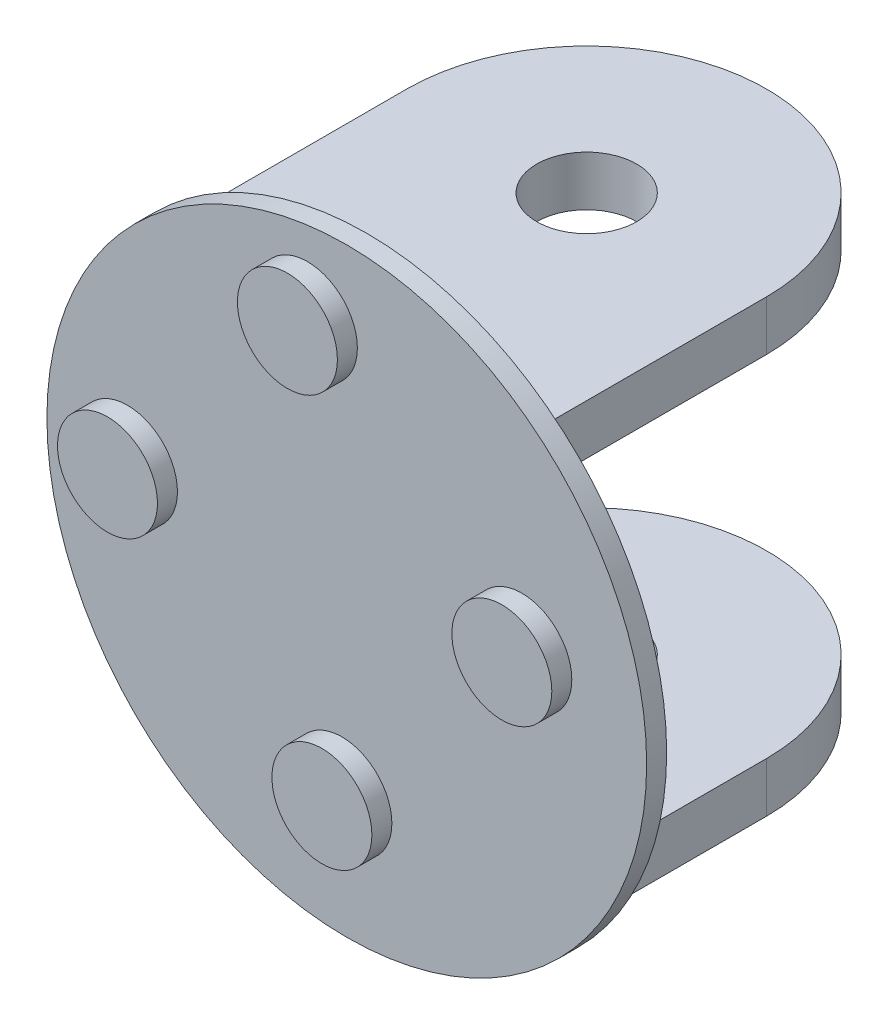
ISO-10303-21;
HEADER;
FILE_DESCRIPTION(('STEP AP214'),'2;1');
FILE_NAME('part.step','',(''),(''),'','','');
FILE_SCHEMA(('AUTOMOTIVE_DESIGN { 1 0 10303 214 1 1 1 1 }'));
ENDSEC;
DATA;
#1=APPLICATION_CONTEXT('core data for automotive mechanical design processes');
#2=APPLICATION_PROTOCOL_DEFINITION('international standard','automotive_design',2000,#1);
#3=PRODUCT_CONTEXT('',#1,'mechanical');
#4=PRODUCT('Part','Part','',(#3));
#5=PRODUCT_RELATED_PRODUCT_CATEGORY('part','',(#4));
#6=PRODUCT_DEFINITION_FORMATION('','',#4);
#7=PRODUCT_DEFINITION_CONTEXT('part definition',#1,'design');
#8=PRODUCT_DEFINITION('design','',#6,#7);
#9=PRODUCT_DEFINITION_SHAPE('','',#8);
#10=(LENGTH_UNIT() NAMED_UNIT(*) SI_UNIT(.MILLI.,.METRE.));
#11=(NAMED_UNIT(*) PLANE_ANGLE_UNIT() SI_UNIT($,.RADIAN.));
#12=(NAMED_UNIT(*) SI_UNIT($,.STERADIAN.) SOLID_ANGLE_UNIT());
#13=UNCERTAINTY_MEASURE_WITH_UNIT(LENGTH_MEASURE(1.E-05),#10,'distance_accuracy_value','');
#14=(GEOMETRIC_REPRESENTATION_CONTEXT(3) GLOBAL_UNCERTAINTY_ASSIGNED_CONTEXT((#13)) GLOBAL_UNIT_ASSIGNED_CONTEXT((#10,
#11,#12)) REPRESENTATION_CONTEXT('',''));
#15=CARTESIAN_POINT('',(0.,0.,0.));
#16=DIRECTION('',(0.,0.,1.));
#17=DIRECTION('',(1.,0.,0.));
#18=AXIS2_PLACEMENT_3D('',#15,#16,#17);
#19=CARTESIAN_POINT('',(0.,0.,-2.));
#20=DIRECTION('',(0.,0.,1.));
#21=DIRECTION('',(1.,0.,0.));
#22=AXIS2_PLACEMENT_3D('',#19,#20,#21);
#23=PLANE('',#22);
#24=DIRECTION('',(1.,0.,0.));
#25=VECTOR('',#24,1.);
#26=CARTESIAN_POINT('',(-18.,17.5,-2.));
#27=LINE('',#26,#25);
#28=CARTESIAN_POINT('',(-18.,17.5,-2.));
#29=VERTEX_POINT('',#28);
#30=CARTESIAN_POINT('',(18.,17.5,-2.));
#31=VERTEX_POINT('',#30);
#32=EDGE_CURVE('E426',#29,#31,#27,.T.);
#33=ORIENTED_EDGE('',*,*,#32,.T.);
#34=DIRECTION('',(0.,1.,0.));
#35=VECTOR('',#34,1.);
#36=CARTESIAN_POINT('',(18.,17.5,-2.));
#37=LINE('',#36,#35);
#38=CARTESIAN_POINT('',(18.,22.5,-2.));
#39=VERTEX_POINT('',#38);
#40=EDGE_CURVE('E420',#31,#39,#37,.T.);
#41=ORIENTED_EDGE('',*,*,#40,.T.);
#42=DIRECTION('',(-1.,0.,0.));
#43=VECTOR('',#42,1.);
#44=CARTESIAN_POINT('',(-18.,22.5,-2.));
#45=LINE('',#44,#43);
#46=CARTESIAN_POINT('',(-18.,22.5,-2.));
#47=VERTEX_POINT('',#46);
#48=EDGE_CURVE('E422',#39,#47,#45,.T.);
#49=ORIENTED_EDGE('',*,*,#48,.T.);
#50=DIRECTION('',(0.,-1.,0.));
#51=VECTOR('',#50,1.);
#52=CARTESIAN_POINT('',(-18.,17.5,-2.));
#53=LINE('',#52,#51);
#54=EDGE_CURVE('E50',#47,#29,#53,.T.);
#55=ORIENTED_EDGE('',*,*,#54,.T.);
#56=EDGE_LOOP('',(#33,#41,#49,#55));
#57=FACE_BOUND('',#56,.T.);
#58=CARTESIAN_POINT('',(0.,0.,-2.));
#59=DIRECTION('',(0.,0.,1.));
#60=DIRECTION('',(1.,0.,0.));
#61=AXIS2_PLACEMENT_3D('',#58,#59,#60);
#62=CIRCLE('',#61,30.);
#63=CARTESIAN_POINT('',(30.,0.,-2.));
#64=VERTEX_POINT('',#63);
#65=EDGE_CURVE('E11',#64,#64,#62,.T.);
#66=ORIENTED_EDGE('',*,*,#65,.F.);
#67=EDGE_LOOP('',(#66));
#68=FACE_BOUND('',#67,.T.);
#69=DIRECTION('',(0.,-1.,0.));
#70=VECTOR('',#69,1.);
#71=CARTESIAN_POINT('',(18.,-17.5,-2.));
#72=LINE('',#71,#70);
#73=CARTESIAN_POINT('',(18.,-17.5,-2.));
#74=VERTEX_POINT('',#73);
#75=CARTESIAN_POINT('',(18.,-22.5,-2.));
#76=VERTEX_POINT('',#75);
#77=EDGE_CURVE('E137',#74,#76,#72,.T.);
#78=ORIENTED_EDGE('',*,*,#77,.F.);
#79=DIRECTION('',(1.,0.,0.));
#80=VECTOR('',#79,1.);
#81=CARTESIAN_POINT('',(-18.,-17.5,-2.));
#82=LINE('',#81,#80);
#83=CARTESIAN_POINT('',(-18.,-17.5,-2.));
#84=VERTEX_POINT('',#83);
#85=EDGE_CURVE('E144',#84,#74,#82,.T.);
#86=ORIENTED_EDGE('',*,*,#85,.F.);
#87=DIRECTION('',(0.,1.,0.));
#88=VECTOR('',#87,1.);
#89=CARTESIAN_POINT('',(-18.,-17.5,-2.));
#90=LINE('',#89,#88);
#91=CARTESIAN_POINT('',(-18.,-22.5,-2.));
#92=VERTEX_POINT('',#91);
#93=EDGE_CURVE('E151',#92,#84,#90,.T.);
#94=ORIENTED_EDGE('',*,*,#93,.F.);
#95=DIRECTION('',(-1.,0.,0.));
#96=VECTOR('',#95,1.);
#97=CARTESIAN_POINT('',(-18.,-22.5,-2.));
#98=LINE('',#97,#96);
#99=EDGE_CURVE('E58',#76,#92,#98,.T.);
#100=ORIENTED_EDGE('',*,*,#99,.F.);
#101=EDGE_LOOP('',(#78,#86,#94,#100));
#102=FACE_BOUND('',#101,.T.);
#103=ADVANCED_FACE('F33',(#57,#68,#102),#23,.F.);
#104=CARTESIAN_POINT('',(0.,0.,-2.));
#105=DIRECTION('',(0.,0.,1.));
#106=DIRECTION('',(1.,0.,0.));
#107=AXIS2_PLACEMENT_3D('',#104,#105,#106);
#108=CYLINDRICAL_SURFACE('',#107,30.);
#109=ORIENTED_EDGE('',*,*,#65,.T.);
#110=EDGE_LOOP('',(#109));
#111=FACE_BOUND('',#110,.T.);
#112=CARTESIAN_POINT('',(0.,0.,0.));
#113=DIRECTION('',(0.,0.,1.));
#114=DIRECTION('',(1.,0.,0.));
#115=AXIS2_PLACEMENT_3D('',#112,#113,#114);
#116=CIRCLE('',#115,30.);
#117=CARTESIAN_POINT('',(30.,0.,0.));
#118=VERTEX_POINT('',#117);
#119=EDGE_CURVE('E42',#118,#118,#116,.T.);
#120=ORIENTED_EDGE('',*,*,#119,.F.);
#121=EDGE_LOOP('',(#120));
#122=FACE_BOUND('',#121,.T.);
#123=ADVANCED_FACE('F35',(#111,#122),#108,.T.);
#124=CARTESIAN_POINT('',(0.,0.,0.));
#125=DIRECTION('',(0.,0.,1.));
#126=DIRECTION('',(1.,0.,0.));
#127=AXIS2_PLACEMENT_3D('',#124,#125,#126);
#128=PLANE('',#127);
#129=CARTESIAN_POINT('',(17.51,3.58,0.));
#130=DIRECTION('',(0.,0.,1.));
#131=DIRECTION('',(1.,0.,0.));
#132=AXIS2_PLACEMENT_3D('',#129,#130,#131);
#133=CIRCLE('',#132,5.);
#134=CARTESIAN_POINT('',(22.51,3.58,0.));
#135=VERTEX_POINT('',#134);
#136=EDGE_CURVE('E395',#135,#135,#133,.T.);
#137=ORIENTED_EDGE('',*,*,#136,.F.);
#138=EDGE_LOOP('',(#137));
#139=FACE_BOUND('',#138,.T.);
#140=CARTESIAN_POINT('',(-0.489999999999994,-17.87,0.));
#141=DIRECTION('',(0.,0.,1.));
#142=DIRECTION('',(1.,0.,0.));
#143=AXIS2_PLACEMENT_3D('',#140,#141,#142);
#144=CIRCLE('',#143,5.);
#145=CARTESIAN_POINT('',(4.51000000000001,-17.87,0.));
#146=VERTEX_POINT('',#145);
#147=EDGE_CURVE('E394',#146,#146,#144,.T.);
#148=ORIENTED_EDGE('',*,*,#147,.F.);
#149=EDGE_LOOP('',(#148));
#150=FACE_BOUND('',#149,.T.);
#151=CARTESIAN_POINT('',(-21.94,0.130000000000002,0.));
#152=DIRECTION('',(0.,0.,1.));
#153=DIRECTION('',(1.,0.,0.));
#154=AXIS2_PLACEMENT_3D('',#151,#152,#153);
#155=CIRCLE('',#154,5.);
#156=CARTESIAN_POINT('',(-16.94,0.130000000000002,0.));
#157=VERTEX_POINT('',#156);
#158=EDGE_CURVE('E404',#157,#157,#155,.T.);
#159=ORIENTED_EDGE('',*,*,#158,.F.);
#160=EDGE_LOOP('',(#159));
#161=FACE_BOUND('',#160,.T.);
#162=CARTESIAN_POINT('',(-3.94,21.58,0.));
#163=DIRECTION('',(0.,0.,1.));
#164=DIRECTION('',(1.,0.,0.));
#165=AXIS2_PLACEMENT_3D('',#162,#163,#164);
#166=CIRCLE('',#165,5.);
#167=CARTESIAN_POINT('',(1.06,21.58,0.));
#168=VERTEX_POINT('',#167);
#169=EDGE_CURVE('E409',#168,#168,#166,.T.);
#170=ORIENTED_EDGE('',*,*,#169,.F.);
#171=EDGE_LOOP('',(#170));
#172=FACE_BOUND('',#171,.T.);
#173=ORIENTED_EDGE('',*,*,#119,.T.);
#174=EDGE_LOOP('',(#173));
#175=FACE_BOUND('',#174,.T.);
#176=ADVANCED_FACE('F168',(#139,#150,#161,#172,#175),#128,.T.);
#177=CARTESIAN_POINT('',(18.,-17.5,-24.));
#178=DIRECTION('',(-1.,0.,0.));
#179=DIRECTION('',(0.,0.,1.));
#180=AXIS2_PLACEMENT_3D('',#177,#178,#179);
#181=PLANE('',#180);
#182=ORIENTED_EDGE('',*,*,#77,.T.);
#183=DIRECTION('',(0.,0.,1.));
#184=VECTOR('',#183,1.);
#185=CARTESIAN_POINT('',(18.,-22.5,-24.));
#186=LINE('',#185,#184);
#187=CARTESIAN_POINT('',(18.,-22.5,-24.));
#188=VERTEX_POINT('',#187);
#189=EDGE_CURVE('E164',#188,#76,#186,.T.);
#190=ORIENTED_EDGE('',*,*,#189,.F.);
#191=DIRECTION('',(0.,-1.,0.));
#192=VECTOR('',#191,1.);
#193=CARTESIAN_POINT('',(18.,-17.5,-24.));
#194=LINE('',#193,#192);
#195=CARTESIAN_POINT('',(18.,-17.5,-24.));
#196=VERTEX_POINT('',#195);
#197=EDGE_CURVE('E140',#196,#188,#194,.T.);
#198=ORIENTED_EDGE('',*,*,#197,.F.);
#199=DIRECTION('',(0.,0.,1.));
#200=VECTOR('',#199,1.);
#201=CARTESIAN_POINT('',(18.,-17.5,-24.));
#202=LINE('',#201,#200);
#203=EDGE_CURVE('E147',#196,#74,#202,.T.);
#204=ORIENTED_EDGE('',*,*,#203,.T.);
#205=EDGE_LOOP('',(#182,#190,#198,#204));
#206=FACE_BOUND('',#205,.T.);
#207=ADVANCED_FACE('F176',(#206),#181,.F.);
#208=CARTESIAN_POINT('',(-18.,-22.5,-24.));
#209=DIRECTION('',(0.,1.,0.));
#210=DIRECTION('',(-1.,0.,0.));
#211=AXIS2_PLACEMENT_3D('',#208,#209,#210);
#212=PLANE('',#211);
#213=CARTESIAN_POINT('',(0.,-22.5,-24.));
#214=DIRECTION('',(0.,1.,0.));
#215=DIRECTION('',(-1.,0.,0.));
#216=AXIS2_PLACEMENT_3D('',#213,#214,#215);
#217=CIRCLE('',#216,5.);
#218=CARTESIAN_POINT('',(-5.00000000000001,-22.5,-24.));
#219=VERTEX_POINT('',#218);
#220=EDGE_CURVE('E130',#219,#219,#217,.T.);
#221=ORIENTED_EDGE('',*,*,#220,.T.);
#222=EDGE_LOOP('',(#221));
#223=FACE_BOUND('',#222,.T.);
#224=ORIENTED_EDGE('',*,*,#99,.T.);
#225=DIRECTION('',(0.,0.,1.));
#226=VECTOR('',#225,1.);
#227=CARTESIAN_POINT('',(-18.,-22.5,-24.));
#228=LINE('',#227,#226);
#229=CARTESIAN_POINT('',(-18.,-22.5,-24.));
#230=VERTEX_POINT('',#229);
#231=EDGE_CURVE('E161',#230,#92,#228,.T.);
#232=ORIENTED_EDGE('',*,*,#231,.F.);
#233=CARTESIAN_POINT('',(0.,-22.5,-24.));
#234=DIRECTION('',(0.,-1.,0.));
#235=DIRECTION('',(1.,0.,0.));
#236=AXIS2_PLACEMENT_3D('',#233,#234,#235);
#237=CIRCLE('',#236,18.);
#238=EDGE_CURVE('E133',#230,#188,#237,.T.);
#239=ORIENTED_EDGE('',*,*,#238,.T.);
#240=ORIENTED_EDGE('',*,*,#189,.T.);
#241=EDGE_LOOP('',(#224,#232,#239,#240));
#242=FACE_BOUND('',#241,.T.);
#243=ADVANCED_FACE('F191',(#223,#242),#212,.F.);
#244=CARTESIAN_POINT('',(-18.,-17.5,-24.));
#245=DIRECTION('',(1.,0.,0.));
#246=DIRECTION('',(0.,0.,-1.));
#247=AXIS2_PLACEMENT_3D('',#244,#245,#246);
#248=PLANE('',#247);
#249=ORIENTED_EDGE('',*,*,#93,.T.);
#250=DIRECTION('',(0.,0.,1.));
#251=VECTOR('',#250,1.);
#252=CARTESIAN_POINT('',(-18.,-17.5,-24.));
#253=LINE('',#252,#251);
#254=CARTESIAN_POINT('',(-18.,-17.5,-24.));
#255=VERTEX_POINT('',#254);
#256=EDGE_CURVE('E158',#255,#84,#253,.T.);
#257=ORIENTED_EDGE('',*,*,#256,.F.);
#258=DIRECTION('',(0.,1.,0.));
#259=VECTOR('',#258,1.);
#260=CARTESIAN_POINT('',(-18.,-17.5,-24.));
#261=LINE('',#260,#259);
#262=EDGE_CURVE('E143',#230,#255,#261,.T.);
#263=ORIENTED_EDGE('',*,*,#262,.F.);
#264=ORIENTED_EDGE('',*,*,#231,.T.);
#265=EDGE_LOOP('',(#249,#257,#263,#264));
#266=FACE_BOUND('',#265,.T.);
#267=ADVANCED_FACE('F194',(#266),#248,.F.);
#268=CARTESIAN_POINT('',(-18.,-17.5,-24.));
#269=DIRECTION('',(0.,-1.,0.));
#270=DIRECTION('',(1.,0.,0.));
#271=AXIS2_PLACEMENT_3D('',#268,#269,#270);
#272=PLANE('',#271);
#273=CARTESIAN_POINT('',(0.,-17.5,-24.));
#274=DIRECTION('',(0.,1.,0.));
#275=DIRECTION('',(-1.,0.,0.));
#276=AXIS2_PLACEMENT_3D('',#273,#274,#275);
#277=CIRCLE('',#276,5.);
#278=CARTESIAN_POINT('',(-5.00000000000001,-17.5,-24.));
#279=VERTEX_POINT('',#278);
#280=EDGE_CURVE('E127',#279,#279,#277,.T.);
#281=ORIENTED_EDGE('',*,*,#280,.F.);
#282=EDGE_LOOP('',(#281));
#283=FACE_BOUND('',#282,.T.);
#284=ORIENTED_EDGE('',*,*,#85,.T.);
#285=ORIENTED_EDGE('',*,*,#203,.F.);
#286=CARTESIAN_POINT('',(0.,-17.5,-24.));
#287=DIRECTION('',(0.,-1.,0.));
#288=DIRECTION('',(1.,0.,0.));
#289=AXIS2_PLACEMENT_3D('',#286,#287,#288);
#290=CIRCLE('',#289,18.);
#291=EDGE_CURVE('E134',#196,#255,#290,.F.);
#292=ORIENTED_EDGE('',*,*,#291,.T.);
#293=ORIENTED_EDGE('',*,*,#256,.T.);
#294=EDGE_LOOP('',(#284,#285,#292,#293));
#295=FACE_BOUND('',#294,.T.);
#296=ADVANCED_FACE('F185',(#283,#295),#272,.F.);
#297=CARTESIAN_POINT('',(0.,22.7492235949962,-24.));
#298=DIRECTION('',(0.,-1.,0.));
#299=DIRECTION('',(1.,0.,0.));
#300=AXIS2_PLACEMENT_3D('',#297,#298,#299);
#301=CYLINDRICAL_SURFACE('',#300,18.);
#302=ORIENTED_EDGE('',*,*,#291,.F.);
#303=ORIENTED_EDGE('',*,*,#197,.T.);
#304=ORIENTED_EDGE('',*,*,#238,.F.);
#305=ORIENTED_EDGE('',*,*,#262,.T.);
#306=EDGE_LOOP('',(#302,#303,#304,#305));
#307=FACE_BOUND('',#306,.T.);
#308=ADVANCED_FACE('F189',(#307),#301,.T.);
#309=CARTESIAN_POINT('',(0.,-39.5,-24.));
#310=DIRECTION('',(0.,1.,0.));
#311=DIRECTION('',(-1.,0.,0.));
#312=AXIS2_PLACEMENT_3D('',#309,#310,#311);
#313=CYLINDRICAL_SURFACE('',#312,5.);
#314=ORIENTED_EDGE('',*,*,#280,.T.);
#315=EDGE_LOOP('',(#314));
#316=FACE_BOUND('',#315,.T.);
#317=ORIENTED_EDGE('',*,*,#220,.F.);
#318=EDGE_LOOP('',(#317));
#319=FACE_BOUND('',#318,.T.);
#320=ADVANCED_FACE('F233',(#316,#319),#313,.F.);
#321=CARTESIAN_POINT('',(18.,17.5,-24.));
#322=DIRECTION('',(1.,0.,0.));
#323=DIRECTION('',(0.,0.,-1.));
#324=AXIS2_PLACEMENT_3D('',#321,#322,#323);
#325=PLANE('',#324);
#326=ORIENTED_EDGE('',*,*,#40,.F.);
#327=DIRECTION('',(0.,0.,1.));
#328=VECTOR('',#327,1.);
#329=CARTESIAN_POINT('',(18.,17.5,-24.));
#330=LINE('',#329,#328);
#331=CARTESIAN_POINT('',(18.,17.5,-24.));
#332=VERTEX_POINT('',#331);
#333=EDGE_CURVE('E121',#332,#31,#330,.T.);
#334=ORIENTED_EDGE('',*,*,#333,.F.);
#335=DIRECTION('',(0.,1.,0.));
#336=VECTOR('',#335,1.);
#337=CARTESIAN_POINT('',(18.,17.5,-24.));
#338=LINE('',#337,#336);
#339=CARTESIAN_POINT('',(18.,22.5,-24.));
#340=VERTEX_POINT('',#339);
#341=EDGE_CURVE('E109',#332,#340,#338,.T.);
#342=ORIENTED_EDGE('',*,*,#341,.T.);
#343=DIRECTION('',(0.,0.,1.));
#344=VECTOR('',#343,1.);
#345=CARTESIAN_POINT('',(18.,22.5,-24.));
#346=LINE('',#345,#344);
#347=EDGE_CURVE('E108',#340,#39,#346,.T.);
#348=ORIENTED_EDGE('',*,*,#347,.T.);
#349=EDGE_LOOP('',(#326,#334,#342,#348));
#350=FACE_BOUND('',#349,.T.);
#351=ADVANCED_FACE('F238',(#350),#325,.T.);
#352=CARTESIAN_POINT('',(-18.,17.5,-24.));
#353=DIRECTION('',(0.,-1.,0.));
#354=DIRECTION('',(1.,0.,0.));
#355=AXIS2_PLACEMENT_3D('',#352,#353,#354);
#356=PLANE('',#355);
#357=CARTESIAN_POINT('',(0.,17.5,-24.));
#358=DIRECTION('',(0.,1.,0.));
#359=DIRECTION('',(-1.,0.,0.));
#360=AXIS2_PLACEMENT_3D('',#357,#358,#359);
#361=CIRCLE('',#360,5.);
#362=CARTESIAN_POINT('',(-5.00000000000001,17.5,-24.));
#363=VERTEX_POINT('',#362);
#364=EDGE_CURVE('E415',#363,#363,#361,.T.);
#365=ORIENTED_EDGE('',*,*,#364,.T.);
#366=EDGE_LOOP('',(#365));
#367=FACE_BOUND('',#366,.T.);
#368=ORIENTED_EDGE('',*,*,#32,.F.);
#369=DIRECTION('',(0.,0.,1.));
#370=VECTOR('',#369,1.);
#371=CARTESIAN_POINT('',(-18.,17.5,-24.));
#372=LINE('',#371,#370);
#373=CARTESIAN_POINT('',(-18.,17.5,-24.));
#374=VERTEX_POINT('',#373);
#375=EDGE_CURVE('E119',#374,#29,#372,.T.);
#376=ORIENTED_EDGE('',*,*,#375,.F.);
#377=CARTESIAN_POINT('',(0.,17.5,-24.));
#378=DIRECTION('',(0.,1.,0.));
#379=DIRECTION('',(-1.,0.,0.));
#380=AXIS2_PLACEMENT_3D('',#377,#378,#379);
#381=CIRCLE('',#380,18.);
#382=EDGE_CURVE('E106',#332,#374,#381,.T.);
#383=ORIENTED_EDGE('',*,*,#382,.F.);
#384=ORIENTED_EDGE('',*,*,#333,.T.);
#385=EDGE_LOOP('',(#368,#376,#383,#384));
#386=FACE_BOUND('',#385,.T.);
#387=ADVANCED_FACE('F255',(#367,#386),#356,.T.);
#388=CARTESIAN_POINT('',(-18.,17.5,-24.));
#389=DIRECTION('',(-1.,0.,0.));
#390=DIRECTION('',(0.,0.,1.));
#391=AXIS2_PLACEMENT_3D('',#388,#389,#390);
#392=PLANE('',#391);
#393=ORIENTED_EDGE('',*,*,#54,.F.);
#394=DIRECTION('',(0.,0.,1.));
#395=VECTOR('',#394,1.);
#396=CARTESIAN_POINT('',(-18.,22.5,-24.));
#397=LINE('',#396,#395);
#398=CARTESIAN_POINT('',(-18.,22.5,-24.));
#399=VERTEX_POINT('',#398);
#400=EDGE_CURVE('E114',#399,#47,#397,.T.);
#401=ORIENTED_EDGE('',*,*,#400,.F.);
#402=DIRECTION('',(0.,-1.,0.));
#403=VECTOR('',#402,1.);
#404=CARTESIAN_POINT('',(-18.,17.5,-24.));
#405=LINE('',#404,#403);
#406=EDGE_CURVE('E100',#399,#374,#405,.T.);
#407=ORIENTED_EDGE('',*,*,#406,.T.);
#408=ORIENTED_EDGE('',*,*,#375,.T.);
#409=EDGE_LOOP('',(#393,#401,#407,#408));
#410=FACE_BOUND('',#409,.T.);
#411=ADVANCED_FACE('F118',(#410),#392,.T.);
#412=CARTESIAN_POINT('',(-18.,22.5,-24.));
#413=DIRECTION('',(0.,1.,0.));
#414=DIRECTION('',(-1.,0.,0.));
#415=AXIS2_PLACEMENT_3D('',#412,#413,#414);
#416=PLANE('',#415);
#417=CARTESIAN_POINT('',(0.,22.5,-24.));
#418=DIRECTION('',(0.,1.,0.));
#419=DIRECTION('',(-1.,0.,0.));
#420=AXIS2_PLACEMENT_3D('',#417,#418,#419);
#421=CIRCLE('',#420,5.);
#422=CARTESIAN_POINT('',(-5.00000000000001,22.5,-24.));
#423=VERTEX_POINT('',#422);
#424=EDGE_CURVE('E37',#423,#423,#421,.F.);
#425=ORIENTED_EDGE('',*,*,#424,.T.);
#426=EDGE_LOOP('',(#425));
#427=FACE_BOUND('',#426,.T.);
#428=ORIENTED_EDGE('',*,*,#48,.F.);
#429=ORIENTED_EDGE('',*,*,#347,.F.);
#430=CARTESIAN_POINT('',(0.,22.5,-24.));
#431=DIRECTION('',(0.,-1.,0.));
#432=DIRECTION('',(1.,0.,0.));
#433=AXIS2_PLACEMENT_3D('',#430,#431,#432);
#434=CIRCLE('',#433,18.);
#435=EDGE_CURVE('E103',#399,#340,#434,.T.);
#436=ORIENTED_EDGE('',*,*,#435,.F.);
#437=ORIENTED_EDGE('',*,*,#400,.T.);
#438=EDGE_LOOP('',(#428,#429,#436,#437));
#439=FACE_BOUND('',#438,.T.);
#440=ADVANCED_FACE('F113',(#427,#439),#416,.T.);
#441=CARTESIAN_POINT('',(0.,-57.7492235949962,-24.));
#442=DIRECTION('',(0.,1.,0.));
#443=DIRECTION('',(-1.,0.,0.));
#444=AXIS2_PLACEMENT_3D('',#441,#442,#443);
#445=CYLINDRICAL_SURFACE('',#444,18.);
#446=ORIENTED_EDGE('',*,*,#341,.F.);
#447=ORIENTED_EDGE('',*,*,#382,.T.);
#448=ORIENTED_EDGE('',*,*,#406,.F.);
#449=ORIENTED_EDGE('',*,*,#435,.T.);
#450=EDGE_LOOP('',(#446,#447,#448,#449));
#451=FACE_BOUND('',#450,.T.);
#452=ADVANCED_FACE('F102',(#451),#445,.T.);
#453=CARTESIAN_POINT('',(0.,39.5,-24.));
#454=DIRECTION('',(0.,-1.,0.));
#455=DIRECTION('',(1.,0.,0.));
#456=AXIS2_PLACEMENT_3D('',#453,#454,#455);
#457=CYLINDRICAL_SURFACE('',#456,5.);
#458=ORIENTED_EDGE('',*,*,#424,.F.);
#459=EDGE_LOOP('',(#458));
#460=FACE_BOUND('',#459,.T.);
#461=ORIENTED_EDGE('',*,*,#364,.F.);
#462=EDGE_LOOP('',(#461));
#463=FACE_BOUND('',#462,.T.);
#464=ADVANCED_FACE('F293',(#460,#463),#457,.F.);
#465=CARTESIAN_POINT('',(-3.94,21.58,2.));
#466=DIRECTION('',(0.,0.,-1.));
#467=DIRECTION('',(-1.,0.,0.));
#468=AXIS2_PLACEMENT_3D('',#465,#466,#467);
#469=CYLINDRICAL_SURFACE('',#468,5.);
#470=CARTESIAN_POINT('',(-3.94,21.58,2.));
#471=DIRECTION('',(0.,0.,1.));
#472=DIRECTION('',(1.,0.,0.));
#473=AXIS2_PLACEMENT_3D('',#470,#471,#472);
#474=CIRCLE('',#473,5.);
#475=CARTESIAN_POINT('',(1.06,21.58,2.));
#476=VERTEX_POINT('',#475);
#477=EDGE_CURVE('E412',#476,#476,#474,.T.);
#478=ORIENTED_EDGE('',*,*,#477,.F.);
#479=EDGE_LOOP('',(#478));
#480=FACE_BOUND('',#479,.T.);
#481=ORIENTED_EDGE('',*,*,#169,.T.);
#482=EDGE_LOOP('',(#481));
#483=FACE_BOUND('',#482,.T.);
#484=ADVANCED_FACE('F301',(#480,#483),#469,.T.);
#485=CARTESIAN_POINT('',(-3.94,21.58,2.));
#486=DIRECTION('',(0.,0.,1.));
#487=DIRECTION('',(1.,0.,0.));
#488=AXIS2_PLACEMENT_3D('',#485,#486,#487);
#489=PLANE('',#488);
#490=ORIENTED_EDGE('',*,*,#477,.T.);
#491=EDGE_LOOP('',(#490));
#492=FACE_BOUND('',#491,.T.);
#493=ADVANCED_FACE('F316',(#492),#489,.T.);
#494=CARTESIAN_POINT('',(-21.94,0.130000000000002,2.));
#495=DIRECTION('',(0.,0.,-1.));
#496=DIRECTION('',(-1.,0.,0.));
#497=AXIS2_PLACEMENT_3D('',#494,#495,#496);
#498=CYLINDRICAL_SURFACE('',#497,5.);
#499=CARTESIAN_POINT('',(-21.94,0.130000000000002,2.));
#500=DIRECTION('',(0.,0.,1.));
#501=DIRECTION('',(1.,0.,0.));
#502=AXIS2_PLACEMENT_3D('',#499,#500,#501);
#503=CIRCLE('',#502,5.);
#504=CARTESIAN_POINT('',(-16.94,0.130000000000002,2.));
#505=VERTEX_POINT('',#504);
#506=EDGE_CURVE('E406',#505,#505,#503,.T.);
#507=ORIENTED_EDGE('',*,*,#506,.F.);
#508=EDGE_LOOP('',(#507));
#509=FACE_BOUND('',#508,.T.);
#510=ORIENTED_EDGE('',*,*,#158,.T.);
#511=EDGE_LOOP('',(#510));
#512=FACE_BOUND('',#511,.T.);
#513=ADVANCED_FACE('F326',(#509,#512),#498,.T.);
#514=CARTESIAN_POINT('',(-21.94,0.130000000000002,2.));
#515=DIRECTION('',(0.,0.,1.));
#516=DIRECTION('',(1.,0.,0.));
#517=AXIS2_PLACEMENT_3D('',#514,#515,#516);
#518=PLANE('',#517);
#519=ORIENTED_EDGE('',*,*,#506,.T.);
#520=EDGE_LOOP('',(#519));
#521=FACE_BOUND('',#520,.T.);
#522=ADVANCED_FACE('F336',(#521),#518,.T.);
#523=CARTESIAN_POINT('',(-0.489999999999994,-17.87,2.));
#524=DIRECTION('',(0.,0.,-1.));
#525=DIRECTION('',(-1.,0.,0.));
#526=AXIS2_PLACEMENT_3D('',#523,#524,#525);
#527=CYLINDRICAL_SURFACE('',#526,5.);
#528=CARTESIAN_POINT('',(-0.489999999999994,-17.87,2.));
#529=DIRECTION('',(0.,0.,1.));
#530=DIRECTION('',(1.,0.,0.));
#531=AXIS2_PLACEMENT_3D('',#528,#529,#530);
#532=CIRCLE('',#531,5.);
#533=CARTESIAN_POINT('',(4.51000000000001,-17.87,2.));
#534=VERTEX_POINT('',#533);
#535=EDGE_CURVE('E398',#534,#534,#532,.T.);
#536=ORIENTED_EDGE('',*,*,#535,.F.);
#537=EDGE_LOOP('',(#536));
#538=FACE_BOUND('',#537,.T.);
#539=ORIENTED_EDGE('',*,*,#147,.T.);
#540=EDGE_LOOP('',(#539));
#541=FACE_BOUND('',#540,.T.);
#542=ADVANCED_FACE('F346',(#538,#541),#527,.T.);
#543=CARTESIAN_POINT('',(-0.489999999999994,-17.87,2.));
#544=DIRECTION('',(0.,0.,1.));
#545=DIRECTION('',(1.,0.,0.));
#546=AXIS2_PLACEMENT_3D('',#543,#544,#545);
#547=PLANE('',#546);
#548=ORIENTED_EDGE('',*,*,#535,.T.);
#549=EDGE_LOOP('',(#548));
#550=FACE_BOUND('',#549,.T.);
#551=ADVANCED_FACE('F356',(#550),#547,.T.);
#552=CARTESIAN_POINT('',(17.51,3.58,2.));
#553=DIRECTION('',(0.,0.,-1.));
#554=DIRECTION('',(-1.,0.,0.));
#555=AXIS2_PLACEMENT_3D('',#552,#553,#554);
#556=CYLINDRICAL_SURFACE('',#555,5.);
#557=CARTESIAN_POINT('',(17.51,3.58,2.));
#558=DIRECTION('',(0.,0.,1.));
#559=DIRECTION('',(1.,0.,0.));
#560=AXIS2_PLACEMENT_3D('',#557,#558,#559);
#561=CIRCLE('',#560,5.);
#562=CARTESIAN_POINT('',(22.51,3.58,2.));
#563=VERTEX_POINT('',#562);
#564=EDGE_CURVE('E393',#563,#563,#561,.T.);
#565=ORIENTED_EDGE('',*,*,#564,.F.);
#566=EDGE_LOOP('',(#565));
#567=FACE_BOUND('',#566,.T.);
#568=ORIENTED_EDGE('',*,*,#136,.T.);
#569=EDGE_LOOP('',(#568));
#570=FACE_BOUND('',#569,.T.);
#571=ADVANCED_FACE('F366',(#567,#570),#556,.T.);
#572=CARTESIAN_POINT('',(17.51,3.58,2.));
#573=DIRECTION('',(0.,0.,1.));
#574=DIRECTION('',(1.,0.,0.));
#575=AXIS2_PLACEMENT_3D('',#572,#573,#574);
#576=PLANE('',#575);
#577=ORIENTED_EDGE('',*,*,#564,.T.);
#578=EDGE_LOOP('',(#577));
#579=FACE_BOUND('',#578,.T.);
#580=ADVANCED_FACE('F376',(#579),#576,.T.);
#581=CLOSED_SHELL('',(#103,#123,#176,#207,#243,#267,#296,#308,#320,#351,#387,#411,#440,#452,
#464,#484,#493,#513,#522,#542,#551,#571,#580));
#582=MANIFOLD_SOLID_BREP('B2',#581);
#583=ADVANCED_BREP_SHAPE_REPRESENTATION('',(#18,#582),#14);
#584=SHAPE_DEFINITION_REPRESENTATION(#9,#583);
ENDSEC;
END-ISO-10303-21;
